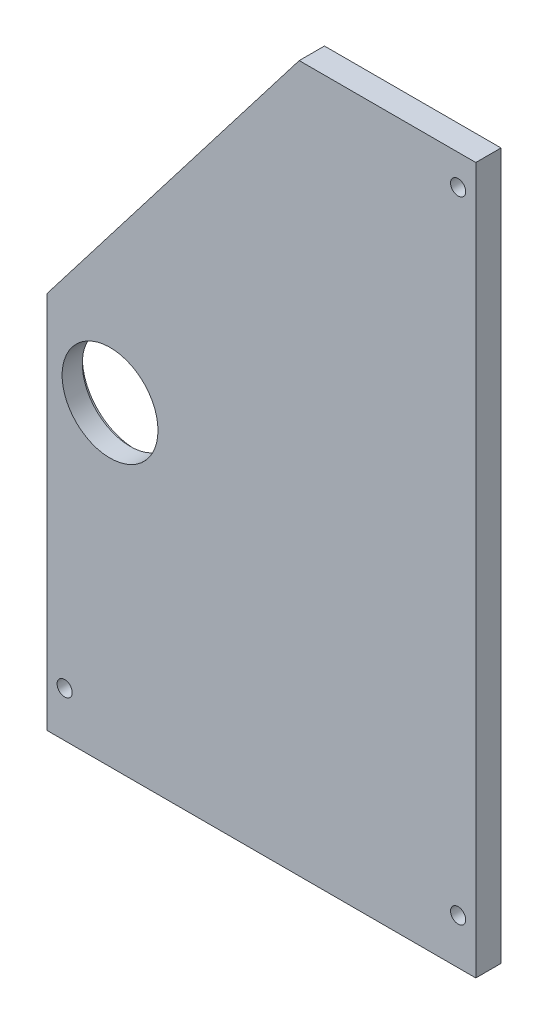
ISO-10303-21;
HEADER;
FILE_DESCRIPTION(('STEP AP214'),'2;1');
FILE_NAME('part.step','',(''),(''),'','','');
FILE_SCHEMA(('AUTOMOTIVE_DESIGN { 1 0 10303 214 1 1 1 1 }'));
ENDSEC;
DATA;
#1=APPLICATION_CONTEXT('core data for automotive mechanical design processes');
#2=APPLICATION_PROTOCOL_DEFINITION('international standard','automotive_design',2000,#1);
#3=PRODUCT_CONTEXT('',#1,'mechanical');
#4=PRODUCT('Part','Part','',(#3));
#5=PRODUCT_RELATED_PRODUCT_CATEGORY('part','',(#4));
#6=PRODUCT_DEFINITION_FORMATION('','',#4);
#7=PRODUCT_DEFINITION_CONTEXT('part definition',#1,'design');
#8=PRODUCT_DEFINITION('design','',#6,#7);
#9=PRODUCT_DEFINITION_SHAPE('','',#8);
#10=(LENGTH_UNIT() NAMED_UNIT(*) SI_UNIT(.MILLI.,.METRE.));
#11=(NAMED_UNIT(*) PLANE_ANGLE_UNIT() SI_UNIT($,.RADIAN.));
#12=(NAMED_UNIT(*) SI_UNIT($,.STERADIAN.) SOLID_ANGLE_UNIT());
#13=UNCERTAINTY_MEASURE_WITH_UNIT(LENGTH_MEASURE(1.E-05),#10,'distance_accuracy_value','');
#14=(GEOMETRIC_REPRESENTATION_CONTEXT(3) GLOBAL_UNCERTAINTY_ASSIGNED_CONTEXT((#13)) GLOBAL_UNIT_ASSIGNED_CONTEXT((#10,
#11,#12)) REPRESENTATION_CONTEXT('',''));
#15=CARTESIAN_POINT('',(0.,0.,0.));
#16=DIRECTION('',(0.,0.,1.));
#17=DIRECTION('',(1.,0.,0.));
#18=AXIS2_PLACEMENT_3D('',#15,#16,#17);
#19=CARTESIAN_POINT('',(-12.5,62.5,5.));
#20=DIRECTION('',(0.,0.,-1.));
#21=DIRECTION('',(-1.,0.,0.));
#22=AXIS2_PLACEMENT_3D('',#19,#20,#21);
#23=CYLINDRICAL_SURFACE('',#22,10.5);
#24=CARTESIAN_POINT('',(-12.5,62.5,0.));
#25=DIRECTION('',(0.,0.,1.));
#26=DIRECTION('',(1.,0.,0.));
#27=AXIS2_PLACEMENT_3D('',#24,#25,#26);
#28=CIRCLE('',#27,10.5);
#29=CARTESIAN_POINT('',(-2.,62.5,0.));
#30=VERTEX_POINT('',#29);
#31=EDGE_CURVE('E164',#30,#30,#28,.T.);
#32=ORIENTED_EDGE('',*,*,#31,.F.);
#33=EDGE_LOOP('',(#32));
#34=FACE_BOUND('',#33,.T.);
#35=CARTESIAN_POINT('',(-12.5,62.5,1.));
#36=DIRECTION('',(0.,0.,1.));
#37=DIRECTION('',(1.,0.,0.));
#38=AXIS2_PLACEMENT_3D('',#35,#36,#37);
#39=CIRCLE('',#38,10.5);
#40=CARTESIAN_POINT('',(-2.,62.5,1.));
#41=VERTEX_POINT('',#40);
#42=EDGE_CURVE('E147',#41,#41,#39,.T.);
#43=ORIENTED_EDGE('',*,*,#42,.T.);
#44=EDGE_LOOP('',(#43));
#45=FACE_BOUND('',#44,.T.);
#46=ADVANCED_FACE('F51',(#34,#45),#23,.F.);
#47=CARTESIAN_POINT('',(0.,140.,5.));
#48=DIRECTION('',(0.,1.,0.));
#49=DIRECTION('',(0.,0.,1.));
#50=AXIS2_PLACEMENT_3D('',#47,#48,#49);
#51=PLANE('',#50);
#52=DIRECTION('',(1.,0.,0.));
#53=VECTOR('',#52,1.);
#54=CARTESIAN_POINT('',(0.,140.,0.));
#55=LINE('',#54,#53);
#56=CARTESIAN_POINT('',(25.,140.,0.));
#57=VERTEX_POINT('',#56);
#58=CARTESIAN_POINT('',(60.,140.,0.));
#59=VERTEX_POINT('',#58);
#60=EDGE_CURVE('E143',#57,#59,#55,.T.);
#61=ORIENTED_EDGE('',*,*,#60,.F.);
#62=DIRECTION('',(0.,0.,-1.));
#63=VECTOR('',#62,1.);
#64=CARTESIAN_POINT('',(25.,140.,5.));
#65=LINE('',#64,#63);
#66=CARTESIAN_POINT('',(25.,140.,5.));
#67=VERTEX_POINT('',#66);
#68=EDGE_CURVE('E12',#67,#57,#65,.T.);
#69=ORIENTED_EDGE('',*,*,#68,.F.);
#70=DIRECTION('',(1.,0.,0.));
#71=VECTOR('',#70,1.);
#72=CARTESIAN_POINT('',(0.,140.,5.));
#73=LINE('',#72,#71);
#74=CARTESIAN_POINT('',(60.,140.,5.));
#75=VERTEX_POINT('',#74);
#76=EDGE_CURVE('E176',#67,#75,#73,.T.);
#77=ORIENTED_EDGE('',*,*,#76,.T.);
#78=DIRECTION('',(0.,0.,-1.));
#79=VECTOR('',#78,1.);
#80=CARTESIAN_POINT('',(60.,140.,5.));
#81=LINE('',#80,#79);
#82=EDGE_CURVE('E69',#75,#59,#81,.T.);
#83=ORIENTED_EDGE('',*,*,#82,.T.);
#84=EDGE_LOOP('',(#61,#69,#77,#83));
#85=FACE_BOUND('',#84,.T.);
#86=ADVANCED_FACE('F53',(#85),#51,.T.);
#87=CARTESIAN_POINT('',(-51.9516728624535,39.9628252788104,5.));
#88=DIRECTION('',(-0.7926239891046,0.609710760849692,0.));
#89=DIRECTION('',(-0.609710760849692,-0.7926239891046,0.));
#90=AXIS2_PLACEMENT_3D('',#87,#88,#89);
#91=PLANE('',#90);
#92=DIRECTION('',(0.609710760849692,0.7926239891046,0.));
#93=VECTOR('',#92,1.);
#94=CARTESIAN_POINT('',(-51.9516728624535,39.9628252788104,0.));
#95=LINE('',#94,#93);
#96=CARTESIAN_POINT('',(-25.,75.,0.));
#97=VERTEX_POINT('',#96);
#98=EDGE_CURVE('E146',#97,#57,#95,.T.);
#99=ORIENTED_EDGE('',*,*,#98,.F.);
#100=DIRECTION('',(0.,0.,-1.));
#101=VECTOR('',#100,1.);
#102=CARTESIAN_POINT('',(-25.,75.,5.));
#103=LINE('',#102,#101);
#104=CARTESIAN_POINT('',(-25.,75.,5.));
#105=VERTEX_POINT('',#104);
#106=EDGE_CURVE('E61',#105,#97,#103,.T.);
#107=ORIENTED_EDGE('',*,*,#106,.F.);
#108=DIRECTION('',(0.609710760849692,0.7926239891046,0.));
#109=VECTOR('',#108,1.);
#110=CARTESIAN_POINT('',(-51.9516728624535,39.9628252788104,5.));
#111=LINE('',#110,#109);
#112=EDGE_CURVE('E120',#105,#67,#111,.T.);
#113=ORIENTED_EDGE('',*,*,#112,.T.);
#114=ORIENTED_EDGE('',*,*,#68,.T.);
#115=EDGE_LOOP('',(#99,#107,#113,#114));
#116=FACE_BOUND('',#115,.T.);
#117=ADVANCED_FACE('F183',(#116),#91,.T.);
#118=CARTESIAN_POINT('',(-25.,0.,5.));
#119=DIRECTION('',(-1.,0.,0.));
#120=DIRECTION('',(0.,0.,1.));
#121=AXIS2_PLACEMENT_3D('',#118,#119,#120);
#122=PLANE('',#121);
#123=DIRECTION('',(0.,1.,0.));
#124=VECTOR('',#123,1.);
#125=CARTESIAN_POINT('',(-25.,0.,0.));
#126=LINE('',#125,#124);
#127=CARTESIAN_POINT('',(-25.,0.,0.));
#128=VERTEX_POINT('',#127);
#129=EDGE_CURVE('E106',#128,#97,#126,.T.);
#130=ORIENTED_EDGE('',*,*,#129,.F.);
#131=DIRECTION('',(0.,0.,-1.));
#132=VECTOR('',#131,1.);
#133=CARTESIAN_POINT('',(-25.,0.,5.));
#134=LINE('',#133,#132);
#135=CARTESIAN_POINT('',(-25.,0.,5.));
#136=VERTEX_POINT('',#135);
#137=EDGE_CURVE('E101',#136,#128,#134,.T.);
#138=ORIENTED_EDGE('',*,*,#137,.F.);
#139=DIRECTION('',(0.,1.,0.));
#140=VECTOR('',#139,1.);
#141=CARTESIAN_POINT('',(-25.,0.,5.));
#142=LINE('',#141,#140);
#143=EDGE_CURVE('E104',#136,#105,#142,.T.);
#144=ORIENTED_EDGE('',*,*,#143,.T.);
#145=ORIENTED_EDGE('',*,*,#106,.T.);
#146=EDGE_LOOP('',(#130,#138,#144,#145));
#147=FACE_BOUND('',#146,.T.);
#148=ADVANCED_FACE('F103',(#147),#122,.T.);
#149=CARTESIAN_POINT('',(0.,0.,5.));
#150=DIRECTION('',(0.,-1.,0.));
#151=DIRECTION('',(1.,0.,0.));
#152=AXIS2_PLACEMENT_3D('',#149,#150,#151);
#153=PLANE('',#152);
#154=DIRECTION('',(-1.,0.,0.));
#155=VECTOR('',#154,1.);
#156=CARTESIAN_POINT('',(0.,0.,0.));
#157=LINE('',#156,#155);
#158=CARTESIAN_POINT('',(60.,0.,0.));
#159=VERTEX_POINT('',#158);
#160=EDGE_CURVE('E153',#159,#128,#157,.T.);
#161=ORIENTED_EDGE('',*,*,#160,.F.);
#162=DIRECTION('',(0.,0.,-1.));
#163=VECTOR('',#162,1.);
#164=CARTESIAN_POINT('',(60.,0.,5.));
#165=LINE('',#164,#163);
#166=CARTESIAN_POINT('',(60.,0.,5.));
#167=VERTEX_POINT('',#166);
#168=EDGE_CURVE('E85',#167,#159,#165,.T.);
#169=ORIENTED_EDGE('',*,*,#168,.F.);
#170=DIRECTION('',(-1.,0.,0.));
#171=VECTOR('',#170,1.);
#172=CARTESIAN_POINT('',(0.,0.,5.));
#173=LINE('',#172,#171);
#174=EDGE_CURVE('E118',#167,#136,#173,.T.);
#175=ORIENTED_EDGE('',*,*,#174,.T.);
#176=ORIENTED_EDGE('',*,*,#137,.T.);
#177=EDGE_LOOP('',(#161,#169,#175,#176));
#178=FACE_BOUND('',#177,.T.);
#179=ADVANCED_FACE('F123',(#178),#153,.T.);
#180=CARTESIAN_POINT('',(56.5,9.00000000000001,5.));
#181=DIRECTION('',(0.,0.,-1.));
#182=DIRECTION('',(-1.,0.,0.));
#183=AXIS2_PLACEMENT_3D('',#180,#181,#182);
#184=CYLINDRICAL_SURFACE('',#183,1.5);
#185=CARTESIAN_POINT('',(56.5,9.00000000000001,5.));
#186=DIRECTION('',(0.,0.,1.));
#187=DIRECTION('',(1.,0.,0.));
#188=AXIS2_PLACEMENT_3D('',#185,#186,#187);
#189=CIRCLE('',#188,1.5);
#190=CARTESIAN_POINT('',(58.,9.00000000000001,5.));
#191=VERTEX_POINT('',#190);
#192=EDGE_CURVE('E135',#191,#191,#189,.T.);
#193=ORIENTED_EDGE('',*,*,#192,.T.);
#194=EDGE_LOOP('',(#193));
#195=FACE_BOUND('',#194,.T.);
#196=CARTESIAN_POINT('',(56.5,9.00000000000001,0.));
#197=DIRECTION('',(0.,0.,1.));
#198=DIRECTION('',(1.,0.,0.));
#199=AXIS2_PLACEMENT_3D('',#196,#197,#198);
#200=CIRCLE('',#199,1.5);
#201=CARTESIAN_POINT('',(58.,9.00000000000001,0.));
#202=VERTEX_POINT('',#201);
#203=EDGE_CURVE('E168',#202,#202,#200,.T.);
#204=ORIENTED_EDGE('',*,*,#203,.F.);
#205=EDGE_LOOP('',(#204));
#206=FACE_BOUND('',#205,.T.);
#207=ADVANCED_FACE('F198',(#195,#206),#184,.F.);
#208=CARTESIAN_POINT('',(-21.5,9.00000000000001,5.));
#209=DIRECTION('',(0.,0.,-1.));
#210=DIRECTION('',(-1.,0.,0.));
#211=AXIS2_PLACEMENT_3D('',#208,#209,#210);
#212=CYLINDRICAL_SURFACE('',#211,1.5);
#213=CARTESIAN_POINT('',(-21.5,9.00000000000001,5.));
#214=DIRECTION('',(0.,0.,1.));
#215=DIRECTION('',(1.,0.,0.));
#216=AXIS2_PLACEMENT_3D('',#213,#214,#215);
#217=CIRCLE('',#216,1.5);
#218=CARTESIAN_POINT('',(-20.,9.00000000000001,5.));
#219=VERTEX_POINT('',#218);
#220=EDGE_CURVE('E128',#219,#219,#217,.T.);
#221=ORIENTED_EDGE('',*,*,#220,.T.);
#222=EDGE_LOOP('',(#221));
#223=FACE_BOUND('',#222,.T.);
#224=CARTESIAN_POINT('',(-21.5,9.00000000000001,0.));
#225=DIRECTION('',(0.,0.,1.));
#226=DIRECTION('',(1.,0.,0.));
#227=AXIS2_PLACEMENT_3D('',#224,#225,#226);
#228=CIRCLE('',#227,1.5);
#229=CARTESIAN_POINT('',(-20.,9.00000000000001,0.));
#230=VERTEX_POINT('',#229);
#231=EDGE_CURVE('E160',#230,#230,#228,.T.);
#232=ORIENTED_EDGE('',*,*,#231,.F.);
#233=EDGE_LOOP('',(#232));
#234=FACE_BOUND('',#233,.T.);
#235=ADVANCED_FACE('F190',(#223,#234),#212,.F.);
#236=CARTESIAN_POINT('',(60.,0.,5.));
#237=DIRECTION('',(1.,0.,0.));
#238=DIRECTION('',(0.,1.,0.));
#239=AXIS2_PLACEMENT_3D('',#236,#237,#238);
#240=PLANE('',#239);
#241=DIRECTION('',(0.,-1.,0.));
#242=VECTOR('',#241,1.);
#243=CARTESIAN_POINT('',(60.,0.,0.));
#244=LINE('',#243,#242);
#245=EDGE_CURVE('E156',#59,#159,#244,.T.);
#246=ORIENTED_EDGE('',*,*,#245,.F.);
#247=ORIENTED_EDGE('',*,*,#82,.F.);
#248=DIRECTION('',(0.,-1.,0.));
#249=VECTOR('',#248,1.);
#250=CARTESIAN_POINT('',(60.,0.,5.));
#251=LINE('',#250,#249);
#252=EDGE_CURVE('E125',#75,#167,#251,.T.);
#253=ORIENTED_EDGE('',*,*,#252,.T.);
#254=ORIENTED_EDGE('',*,*,#168,.T.);
#255=EDGE_LOOP('',(#246,#247,#253,#254));
#256=FACE_BOUND('',#255,.T.);
#257=ADVANCED_FACE('F187',(#256),#240,.T.);
#258=CARTESIAN_POINT('',(56.5,134.,5.));
#259=DIRECTION('',(0.,0.,-1.));
#260=DIRECTION('',(-1.,0.,0.));
#261=AXIS2_PLACEMENT_3D('',#258,#259,#260);
#262=CYLINDRICAL_SURFACE('',#261,1.5);
#263=CARTESIAN_POINT('',(56.5,134.,5.));
#264=DIRECTION('',(0.,0.,1.));
#265=DIRECTION('',(1.,0.,0.));
#266=AXIS2_PLACEMENT_3D('',#263,#264,#265);
#267=CIRCLE('',#266,1.5);
#268=CARTESIAN_POINT('',(58.,134.,5.));
#269=VERTEX_POINT('',#268);
#270=EDGE_CURVE('E139',#269,#269,#267,.T.);
#271=ORIENTED_EDGE('',*,*,#270,.T.);
#272=EDGE_LOOP('',(#271));
#273=FACE_BOUND('',#272,.T.);
#274=CARTESIAN_POINT('',(56.5,134.,0.));
#275=DIRECTION('',(0.,0.,1.));
#276=DIRECTION('',(1.,0.,0.));
#277=AXIS2_PLACEMENT_3D('',#274,#275,#276);
#278=CIRCLE('',#277,1.5);
#279=CARTESIAN_POINT('',(58.,134.,0.));
#280=VERTEX_POINT('',#279);
#281=EDGE_CURVE('E172',#280,#280,#278,.T.);
#282=ORIENTED_EDGE('',*,*,#281,.F.);
#283=EDGE_LOOP('',(#282));
#284=FACE_BOUND('',#283,.T.);
#285=ADVANCED_FACE('F189',(#273,#284),#262,.F.);
#286=CARTESIAN_POINT('',(0.,0.,5.));
#287=DIRECTION('',(0.,0.,1.));
#288=DIRECTION('',(1.,0.,0.));
#289=AXIS2_PLACEMENT_3D('',#286,#287,#288);
#290=PLANE('',#289);
#291=ORIENTED_EDGE('',*,*,#76,.F.);
#292=ORIENTED_EDGE('',*,*,#112,.F.);
#293=ORIENTED_EDGE('',*,*,#143,.F.);
#294=ORIENTED_EDGE('',*,*,#174,.F.);
#295=ORIENTED_EDGE('',*,*,#252,.F.);
#296=EDGE_LOOP('',(#291,#292,#293,#294,#295));
#297=FACE_BOUND('',#296,.T.);
#298=ORIENTED_EDGE('',*,*,#220,.F.);
#299=EDGE_LOOP('',(#298));
#300=FACE_BOUND('',#299,.T.);
#301=ORIENTED_EDGE('',*,*,#192,.F.);
#302=EDGE_LOOP('',(#301));
#303=FACE_BOUND('',#302,.T.);
#304=ORIENTED_EDGE('',*,*,#270,.F.);
#305=EDGE_LOOP('',(#304));
#306=FACE_BOUND('',#305,.T.);
#307=CARTESIAN_POINT('',(-12.5,62.5,5.));
#308=DIRECTION('',(0.,0.,1.));
#309=DIRECTION('',(1.,0.,0.));
#310=AXIS2_PLACEMENT_3D('',#307,#308,#309);
#311=CIRCLE('',#310,9.5);
#312=CARTESIAN_POINT('',(-3.,62.5,5.));
#313=VERTEX_POINT('',#312);
#314=EDGE_CURVE('E233',#313,#313,#311,.T.);
#315=ORIENTED_EDGE('',*,*,#314,.F.);
#316=EDGE_LOOP('',(#315));
#317=FACE_BOUND('',#316,.T.);
#318=ADVANCED_FACE('F115',(#297,#300,#303,#306,#317),#290,.T.);
#319=CARTESIAN_POINT('',(0.,0.,0.));
#320=DIRECTION('',(0.,0.,1.));
#321=DIRECTION('',(1.,0.,0.));
#322=AXIS2_PLACEMENT_3D('',#319,#320,#321);
#323=PLANE('',#322);
#324=ORIENTED_EDGE('',*,*,#60,.T.);
#325=ORIENTED_EDGE('',*,*,#245,.T.);
#326=ORIENTED_EDGE('',*,*,#160,.T.);
#327=ORIENTED_EDGE('',*,*,#129,.T.);
#328=ORIENTED_EDGE('',*,*,#98,.T.);
#329=EDGE_LOOP('',(#324,#325,#326,#327,#328));
#330=FACE_BOUND('',#329,.T.);
#331=ORIENTED_EDGE('',*,*,#231,.T.);
#332=EDGE_LOOP('',(#331));
#333=FACE_BOUND('',#332,.T.);
#334=ORIENTED_EDGE('',*,*,#31,.T.);
#335=EDGE_LOOP('',(#334));
#336=FACE_BOUND('',#335,.T.);
#337=ORIENTED_EDGE('',*,*,#203,.T.);
#338=EDGE_LOOP('',(#337));
#339=FACE_BOUND('',#338,.T.);
#340=ORIENTED_EDGE('',*,*,#281,.T.);
#341=EDGE_LOOP('',(#340));
#342=FACE_BOUND('',#341,.T.);
#343=ADVANCED_FACE('F185',(#330,#333,#336,#339,#342),#323,.F.);
#344=CARTESIAN_POINT('',(-12.5,62.5,1.));
#345=DIRECTION('',(0.,0.,1.));
#346=DIRECTION('',(1.,0.,0.));
#347=AXIS2_PLACEMENT_3D('',#344,#345,#346);
#348=PLANE('',#347);
#349=CARTESIAN_POINT('',(-12.5,62.5,1.));
#350=DIRECTION('',(0.,0.,1.));
#351=DIRECTION('',(1.,0.,0.));
#352=AXIS2_PLACEMENT_3D('',#349,#350,#351);
#353=CIRCLE('',#352,9.5);
#354=CARTESIAN_POINT('',(-3.,62.5,1.));
#355=VERTEX_POINT('',#354);
#356=EDGE_CURVE('E230',#355,#355,#353,.T.);
#357=ORIENTED_EDGE('',*,*,#356,.T.);
#358=EDGE_LOOP('',(#357));
#359=FACE_BOUND('',#358,.T.);
#360=ORIENTED_EDGE('',*,*,#42,.F.);
#361=EDGE_LOOP('',(#360));
#362=FACE_BOUND('',#361,.T.);
#363=ADVANCED_FACE('F216',(#359,#362),#348,.F.);
#364=CARTESIAN_POINT('',(-12.5,62.5,1.));
#365=DIRECTION('',(0.,0.,1.));
#366=DIRECTION('',(1.,0.,0.));
#367=AXIS2_PLACEMENT_3D('',#364,#365,#366);
#368=CYLINDRICAL_SURFACE('',#367,9.5);
#369=ORIENTED_EDGE('',*,*,#356,.F.);
#370=EDGE_LOOP('',(#369));
#371=FACE_BOUND('',#370,.T.);
#372=ORIENTED_EDGE('',*,*,#314,.T.);
#373=EDGE_LOOP('',(#372));
#374=FACE_BOUND('',#373,.T.);
#375=ADVANCED_FACE('F221',(#371,#374),#368,.F.);
#376=CLOSED_SHELL('',(#46,#86,#117,#148,#179,#207,#235,#257,#285,#318,#343,#363,#375));
#377=MANIFOLD_SOLID_BREP('B2',#376);
#378=ADVANCED_BREP_SHAPE_REPRESENTATION('',(#18,#377),#14);
#379=SHAPE_DEFINITION_REPRESENTATION(#9,#378);
ENDSEC;
END-ISO-10303-21;
